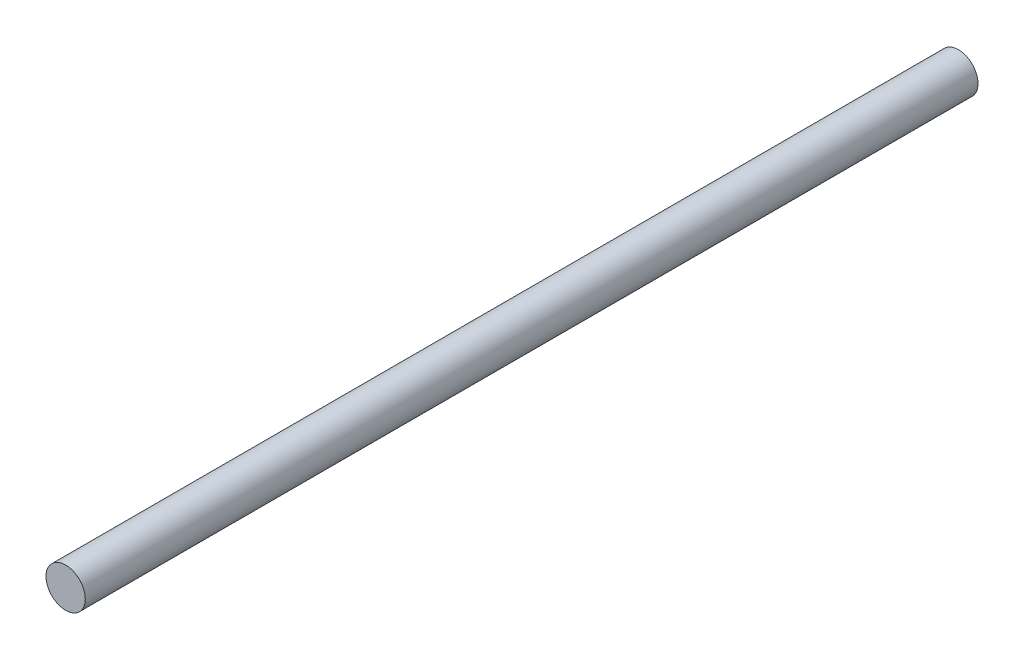
ISO-10303-21;
HEADER;
FILE_DESCRIPTION(('STEP AP214'),'2;1');
FILE_NAME('part.step','',(''),(''),'','','');
FILE_SCHEMA(('AUTOMOTIVE_DESIGN { 1 0 10303 214 1 1 1 1 }'));
ENDSEC;
DATA;
#1=APPLICATION_CONTEXT('core data for automotive mechanical design processes');
#2=APPLICATION_PROTOCOL_DEFINITION('international standard','automotive_design',2000,#1);
#3=PRODUCT_CONTEXT('',#1,'mechanical');
#4=PRODUCT('Part','Part','',(#3));
#5=PRODUCT_RELATED_PRODUCT_CATEGORY('part','',(#4));
#6=PRODUCT_DEFINITION_FORMATION('','',#4);
#7=PRODUCT_DEFINITION_CONTEXT('part definition',#1,'design');
#8=PRODUCT_DEFINITION('design','',#6,#7);
#9=PRODUCT_DEFINITION_SHAPE('','',#8);
#10=(LENGTH_UNIT() NAMED_UNIT(*) SI_UNIT(.MILLI.,.METRE.));
#11=(NAMED_UNIT(*) PLANE_ANGLE_UNIT() SI_UNIT($,.RADIAN.));
#12=(NAMED_UNIT(*) SI_UNIT($,.STERADIAN.) SOLID_ANGLE_UNIT());
#13=UNCERTAINTY_MEASURE_WITH_UNIT(LENGTH_MEASURE(1.E-05),#10,'distance_accuracy_value','');
#14=(GEOMETRIC_REPRESENTATION_CONTEXT(3) GLOBAL_UNCERTAINTY_ASSIGNED_CONTEXT((#13)) GLOBAL_UNIT_ASSIGNED_CONTEXT((#10,
#11,#12)) REPRESENTATION_CONTEXT('',''));
#15=CARTESIAN_POINT('',(0.,0.,0.));
#16=DIRECTION('',(0.,0.,1.));
#17=DIRECTION('',(1.,0.,0.));
#18=AXIS2_PLACEMENT_3D('',#15,#16,#17);
#19=CARTESIAN_POINT('',(0.,0.,36.3553967811146));
#20=DIRECTION('',(0.,0.,1.));
#21=DIRECTION('',(1.,0.,0.));
#22=AXIS2_PLACEMENT_3D('',#19,#20,#21);
#23=PLANE('',#22);
#24=CARTESIAN_POINT('',(0.,0.,36.3553967811146));
#25=DIRECTION('',(0.,0.,-1.));
#26=DIRECTION('',(-1.,0.,0.));
#27=AXIS2_PLACEMENT_3D('',#24,#25,#26);
#28=CIRCLE('',#27,1.6);
#29=CARTESIAN_POINT('',(-1.6,0.,36.3553967811146));
#30=VERTEX_POINT('',#29);
#31=EDGE_CURVE('E9',#30,#30,#28,.T.);
#32=ORIENTED_EDGE('',*,*,#31,.F.);
#33=EDGE_LOOP('',(#32));
#34=FACE_BOUND('',#33,.T.);
#35=ADVANCED_FACE('F14',(#34),#23,.T.);
#36=CARTESIAN_POINT('',(0.,0.,-36.3553967811146));
#37=DIRECTION('',(0.,0.,-1.));
#38=DIRECTION('',(-1.,0.,0.));
#39=AXIS2_PLACEMENT_3D('',#36,#37,#38);
#40=PLANE('',#39);
#41=CARTESIAN_POINT('',(0.,0.,-36.3553967811146));
#42=DIRECTION('',(0.,0.,1.));
#43=DIRECTION('',(1.,0.,0.));
#44=AXIS2_PLACEMENT_3D('',#41,#42,#43);
#45=CIRCLE('',#44,1.6);
#46=CARTESIAN_POINT('',(1.6,0.,-36.3553967811146));
#47=VERTEX_POINT('',#46);
#48=EDGE_CURVE('E21',#47,#47,#45,.T.);
#49=ORIENTED_EDGE('',*,*,#48,.F.);
#50=EDGE_LOOP('',(#49));
#51=FACE_BOUND('',#50,.T.);
#52=ADVANCED_FACE('F29',(#51),#40,.T.);
#53=CARTESIAN_POINT('',(0.,0.,-36.3553967811146));
#54=DIRECTION('',(0.,0.,1.));
#55=DIRECTION('',(1.,0.,0.));
#56=AXIS2_PLACEMENT_3D('',#53,#54,#55);
#57=CYLINDRICAL_SURFACE('',#56,1.6);
#58=ORIENTED_EDGE('',*,*,#31,.T.);
#59=EDGE_LOOP('',(#58));
#60=FACE_BOUND('',#59,.T.);
#61=ORIENTED_EDGE('',*,*,#48,.T.);
#62=EDGE_LOOP('',(#61));
#63=FACE_BOUND('',#62,.T.);
#64=ADVANCED_FACE('F16',(#60,#63),#57,.T.);
#65=CLOSED_SHELL('',(#35,#52,#64));
#66=MANIFOLD_SOLID_BREP('B1',#65);
#67=ADVANCED_BREP_SHAPE_REPRESENTATION('',(#18,#66),#14);
#68=SHAPE_DEFINITION_REPRESENTATION(#9,#67);
ENDSEC;
END-ISO-10303-21;
